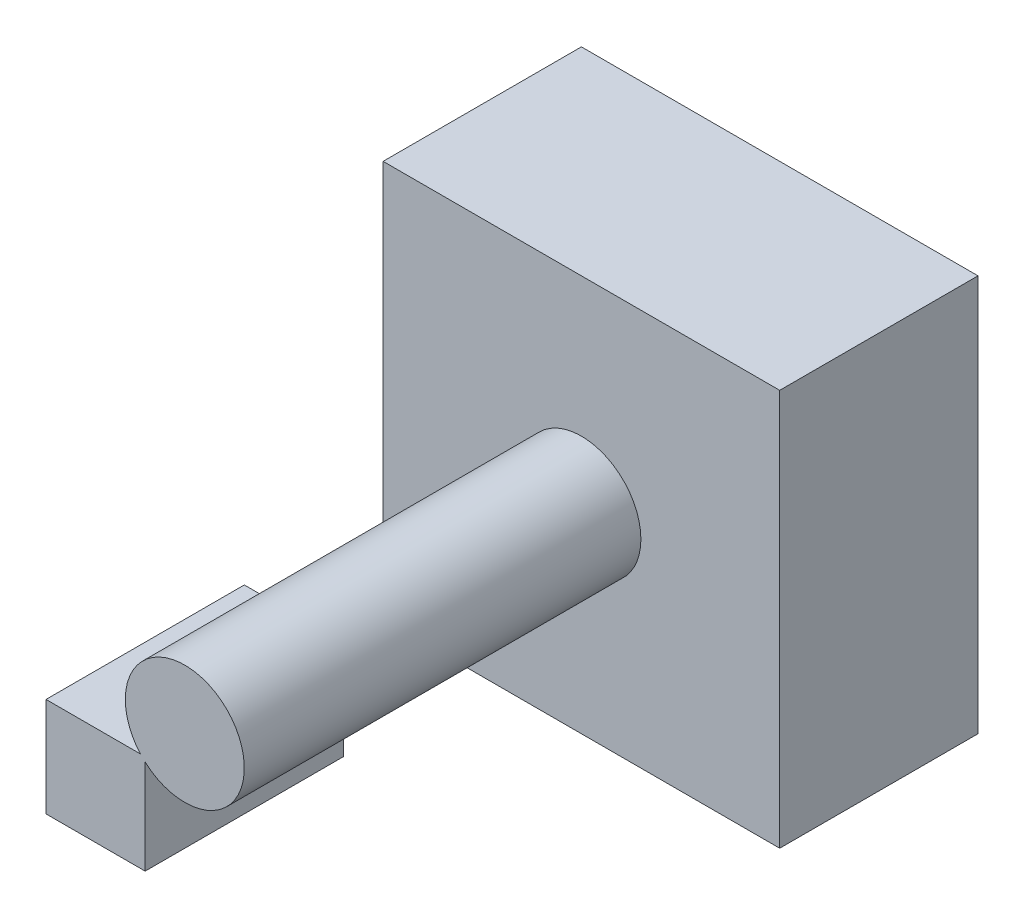
ISO-10303-21;
HEADER;
FILE_DESCRIPTION(('STEP AP214'),'2;1');
FILE_NAME('part.step','',(''),(''),'','','');
FILE_SCHEMA(('AUTOMOTIVE_DESIGN { 1 0 10303 214 1 1 1 1 }'));
ENDSEC;
DATA;
#1=APPLICATION_CONTEXT('core data for automotive mechanical design processes');
#2=APPLICATION_PROTOCOL_DEFINITION('international standard','automotive_design',2000,#1);
#3=PRODUCT_CONTEXT('',#1,'mechanical');
#4=PRODUCT('Part','Part','',(#3));
#5=PRODUCT_RELATED_PRODUCT_CATEGORY('part','',(#4));
#6=PRODUCT_DEFINITION_FORMATION('','',#4);
#7=PRODUCT_DEFINITION_CONTEXT('part definition',#1,'design');
#8=PRODUCT_DEFINITION('design','',#6,#7);
#9=PRODUCT_DEFINITION_SHAPE('','',#8);
#10=(LENGTH_UNIT() NAMED_UNIT(*) SI_UNIT(.MILLI.,.METRE.));
#11=(NAMED_UNIT(*) PLANE_ANGLE_UNIT() SI_UNIT($,.RADIAN.));
#12=(NAMED_UNIT(*) SI_UNIT($,.STERADIAN.) SOLID_ANGLE_UNIT());
#13=UNCERTAINTY_MEASURE_WITH_UNIT(LENGTH_MEASURE(1.E-05),#10,'distance_accuracy_value','');
#14=(GEOMETRIC_REPRESENTATION_CONTEXT(3) GLOBAL_UNCERTAINTY_ASSIGNED_CONTEXT((#13)) GLOBAL_UNIT_ASSIGNED_CONTEXT((#10,
#11,#12)) REPRESENTATION_CONTEXT('',''));
#15=CARTESIAN_POINT('',(0.,0.,0.));
#16=DIRECTION('',(0.,0.,1.));
#17=DIRECTION('',(1.,0.,0.));
#18=AXIS2_PLACEMENT_3D('',#15,#16,#17);
#19=CARTESIAN_POINT('',(10.,10.,30.));
#20=DIRECTION('',(0.,0.,-1.));
#21=DIRECTION('',(-1.,0.,0.));
#22=AXIS2_PLACEMENT_3D('',#19,#20,#21);
#23=CYLINDRICAL_SURFACE('',#22,3.);
#24=CARTESIAN_POINT('',(10.,10.,10.));
#25=DIRECTION('',(0.,0.,1.));
#26=DIRECTION('',(1.,0.,0.));
#27=AXIS2_PLACEMENT_3D('',#24,#25,#26);
#28=CIRCLE('',#27,3.);
#29=CARTESIAN_POINT('',(13.,10.,10.));
#30=VERTEX_POINT('',#29);
#31=EDGE_CURVE('E49',#30,#30,#28,.T.);
#32=ORIENTED_EDGE('',*,*,#31,.T.);
#33=EDGE_LOOP('',(#32));
#34=FACE_BOUND('',#33,.T.);
#35=DIRECTION('',(0.,0.,-1.));
#36=VECTOR('',#35,1.);
#37=CARTESIAN_POINT('',(8.,7.76393202250021,30.));
#38=LINE('',#37,#36);
#39=CARTESIAN_POINT('',(8.,7.76393202250021,20.));
#40=VERTEX_POINT('',#39);
#41=CARTESIAN_POINT('',(8.,7.76393202250021,30.));
#42=VERTEX_POINT('',#41);
#43=EDGE_CURVE('E149',#40,#42,#38,.F.);
#44=ORIENTED_EDGE('',*,*,#43,.F.);
#45=CARTESIAN_POINT('',(10.,10.,20.));
#46=DIRECTION('',(0.,0.,-1.));
#47=DIRECTION('',(-1.,0.,0.));
#48=AXIS2_PLACEMENT_3D('',#45,#46,#47);
#49=CIRCLE('',#48,3.);
#50=CARTESIAN_POINT('',(7.76393202250021,8.,20.));
#51=VERTEX_POINT('',#50);
#52=EDGE_CURVE('E11',#40,#51,#49,.T.);
#53=ORIENTED_EDGE('',*,*,#52,.T.);
#54=DIRECTION('',(0.,0.,-1.));
#55=VECTOR('',#54,1.);
#56=CARTESIAN_POINT('',(7.76393202250021,8.,30.));
#57=LINE('',#56,#55);
#58=CARTESIAN_POINT('',(7.76393202250021,8.,30.));
#59=VERTEX_POINT('',#58);
#60=EDGE_CURVE('E150',#59,#51,#57,.T.);
#61=ORIENTED_EDGE('',*,*,#60,.F.);
#62=CARTESIAN_POINT('',(10.,10.,30.));
#63=DIRECTION('',(0.,0.,1.));
#64=DIRECTION('',(1.,0.,0.));
#65=AXIS2_PLACEMENT_3D('',#62,#63,#64);
#66=CIRCLE('',#65,3.);
#67=EDGE_CURVE('E156',#42,#59,#66,.T.);
#68=ORIENTED_EDGE('',*,*,#67,.F.);
#69=EDGE_LOOP('',(#44,#53,#61,#68));
#70=FACE_BOUND('',#69,.T.);
#71=ADVANCED_FACE('F45',(#34,#70),#23,.T.);
#72=CARTESIAN_POINT('',(0.,0.,10.));
#73=DIRECTION('',(1.,0.,0.));
#74=DIRECTION('',(0.,0.,-1.));
#75=AXIS2_PLACEMENT_3D('',#72,#73,#74);
#76=PLANE('',#75);
#77=DIRECTION('',(0.,-1.,0.));
#78=VECTOR('',#77,1.);
#79=CARTESIAN_POINT('',(0.,0.,0.));
#80=LINE('',#79,#78);
#81=CARTESIAN_POINT('',(0.,20.,0.));
#82=VERTEX_POINT('',#81);
#83=CARTESIAN_POINT('',(0.,0.,0.));
#84=VERTEX_POINT('',#83);
#85=EDGE_CURVE('E158',#82,#84,#80,.T.);
#86=ORIENTED_EDGE('',*,*,#85,.T.);
#87=DIRECTION('',(0.,0.,-1.));
#88=VECTOR('',#87,1.);
#89=CARTESIAN_POINT('',(0.,0.,10.));
#90=LINE('',#89,#88);
#91=CARTESIAN_POINT('',(0.,0.,10.));
#92=VERTEX_POINT('',#91);
#93=EDGE_CURVE('E161',#92,#84,#90,.T.);
#94=ORIENTED_EDGE('',*,*,#93,.F.);
#95=DIRECTION('',(0.,-1.,0.));
#96=VECTOR('',#95,1.);
#97=CARTESIAN_POINT('',(0.,0.,10.));
#98=LINE('',#97,#96);
#99=CARTESIAN_POINT('',(0.,20.,10.));
#100=VERTEX_POINT('',#99);
#101=EDGE_CURVE('E165',#100,#92,#98,.T.);
#102=ORIENTED_EDGE('',*,*,#101,.F.);
#103=DIRECTION('',(0.,0.,-1.));
#104=VECTOR('',#103,1.);
#105=CARTESIAN_POINT('',(0.,20.,10.));
#106=LINE('',#105,#104);
#107=EDGE_CURVE('E169',#100,#82,#106,.T.);
#108=ORIENTED_EDGE('',*,*,#107,.T.);
#109=EDGE_LOOP('',(#86,#94,#102,#108));
#110=FACE_BOUND('',#109,.T.);
#111=ADVANCED_FACE('F42',(#110),#76,.F.);
#112=CARTESIAN_POINT('',(0.,0.,10.));
#113=DIRECTION('',(0.,1.,0.));
#114=DIRECTION('',(0.,0.,1.));
#115=AXIS2_PLACEMENT_3D('',#112,#113,#114);
#116=PLANE('',#115);
#117=DIRECTION('',(1.,0.,0.));
#118=VECTOR('',#117,1.);
#119=CARTESIAN_POINT('',(0.,0.,0.));
#120=LINE('',#119,#118);
#121=CARTESIAN_POINT('',(20.,0.,0.));
#122=VERTEX_POINT('',#121);
#123=EDGE_CURVE('E173',#84,#122,#120,.T.);
#124=ORIENTED_EDGE('',*,*,#123,.T.);
#125=DIRECTION('',(0.,0.,-1.));
#126=VECTOR('',#125,1.);
#127=CARTESIAN_POINT('',(20.,0.,10.));
#128=LINE('',#127,#126);
#129=CARTESIAN_POINT('',(20.,0.,10.));
#130=VERTEX_POINT('',#129);
#131=EDGE_CURVE('E177',#130,#122,#128,.T.);
#132=ORIENTED_EDGE('',*,*,#131,.F.);
#133=DIRECTION('',(1.,0.,0.));
#134=VECTOR('',#133,1.);
#135=CARTESIAN_POINT('',(0.,0.,10.));
#136=LINE('',#135,#134);
#137=EDGE_CURVE('E92',#92,#130,#136,.T.);
#138=ORIENTED_EDGE('',*,*,#137,.F.);
#139=ORIENTED_EDGE('',*,*,#93,.T.);
#140=EDGE_LOOP('',(#124,#132,#138,#139));
#141=FACE_BOUND('',#140,.T.);
#142=ADVANCED_FACE('F185',(#141),#116,.F.);
#143=CARTESIAN_POINT('',(20.,0.,10.));
#144=DIRECTION('',(-1.,0.,0.));
#145=DIRECTION('',(0.,0.,1.));
#146=AXIS2_PLACEMENT_3D('',#143,#144,#145);
#147=PLANE('',#146);
#148=DIRECTION('',(0.,1.,0.));
#149=VECTOR('',#148,1.);
#150=CARTESIAN_POINT('',(20.,0.,0.));
#151=LINE('',#150,#149);
#152=CARTESIAN_POINT('',(20.,20.,0.));
#153=VERTEX_POINT('',#152);
#154=EDGE_CURVE('E172',#122,#153,#151,.T.);
#155=ORIENTED_EDGE('',*,*,#154,.T.);
#156=DIRECTION('',(0.,0.,-1.));
#157=VECTOR('',#156,1.);
#158=CARTESIAN_POINT('',(20.,20.,10.));
#159=LINE('',#158,#157);
#160=CARTESIAN_POINT('',(20.,20.,10.));
#161=VERTEX_POINT('',#160);
#162=EDGE_CURVE('E180',#161,#153,#159,.T.);
#163=ORIENTED_EDGE('',*,*,#162,.F.);
#164=DIRECTION('',(0.,1.,0.));
#165=VECTOR('',#164,1.);
#166=CARTESIAN_POINT('',(20.,0.,10.));
#167=LINE('',#166,#165);
#168=EDGE_CURVE('E164',#130,#161,#167,.T.);
#169=ORIENTED_EDGE('',*,*,#168,.F.);
#170=ORIENTED_EDGE('',*,*,#131,.T.);
#171=EDGE_LOOP('',(#155,#163,#169,#170));
#172=FACE_BOUND('',#171,.T.);
#173=ADVANCED_FACE('F192',(#172),#147,.F.);
#174=CARTESIAN_POINT('',(0.,20.,10.));
#175=DIRECTION('',(0.,-1.,0.));
#176=DIRECTION('',(0.,0.,-1.));
#177=AXIS2_PLACEMENT_3D('',#174,#175,#176);
#178=PLANE('',#177);
#179=DIRECTION('',(-1.,0.,0.));
#180=VECTOR('',#179,1.);
#181=CARTESIAN_POINT('',(0.,20.,0.));
#182=LINE('',#181,#180);
#183=EDGE_CURVE('E87',#153,#82,#182,.T.);
#184=ORIENTED_EDGE('',*,*,#183,.T.);
#185=ORIENTED_EDGE('',*,*,#107,.F.);
#186=DIRECTION('',(-1.,0.,0.));
#187=VECTOR('',#186,1.);
#188=CARTESIAN_POINT('',(0.,20.,10.));
#189=LINE('',#188,#187);
#190=EDGE_CURVE('E68',#161,#100,#189,.T.);
#191=ORIENTED_EDGE('',*,*,#190,.F.);
#192=ORIENTED_EDGE('',*,*,#162,.T.);
#193=EDGE_LOOP('',(#184,#185,#191,#192));
#194=FACE_BOUND('',#193,.T.);
#195=ADVANCED_FACE('F195',(#194),#178,.F.);
#196=CARTESIAN_POINT('',(0.,0.,10.));
#197=DIRECTION('',(0.,0.,-1.));
#198=DIRECTION('',(-1.,0.,0.));
#199=AXIS2_PLACEMENT_3D('',#196,#197,#198);
#200=PLANE('',#199);
#201=ORIENTED_EDGE('',*,*,#31,.F.);
#202=EDGE_LOOP('',(#201));
#203=FACE_BOUND('',#202,.T.);
#204=ORIENTED_EDGE('',*,*,#101,.T.);
#205=ORIENTED_EDGE('',*,*,#137,.T.);
#206=ORIENTED_EDGE('',*,*,#168,.T.);
#207=ORIENTED_EDGE('',*,*,#190,.T.);
#208=EDGE_LOOP('',(#204,#205,#206,#207));
#209=FACE_BOUND('',#208,.T.);
#210=ADVANCED_FACE('F191',(#203,#209),#200,.F.);
#211=CARTESIAN_POINT('',(0.,0.,0.));
#212=DIRECTION('',(0.,0.,-1.));
#213=DIRECTION('',(-1.,0.,0.));
#214=AXIS2_PLACEMENT_3D('',#211,#212,#213);
#215=PLANE('',#214);
#216=ORIENTED_EDGE('',*,*,#85,.F.);
#217=ORIENTED_EDGE('',*,*,#183,.F.);
#218=ORIENTED_EDGE('',*,*,#154,.F.);
#219=ORIENTED_EDGE('',*,*,#123,.F.);
#220=EDGE_LOOP('',(#216,#217,#218,#219));
#221=FACE_BOUND('',#220,.T.);
#222=ADVANCED_FACE('F189',(#221),#215,.T.);
#223=CARTESIAN_POINT('',(10.,10.,30.));
#224=DIRECTION('',(0.,0.,1.));
#225=DIRECTION('',(1.,0.,0.));
#226=AXIS2_PLACEMENT_3D('',#223,#224,#225);
#227=PLANE('',#226);
#228=ORIENTED_EDGE('',*,*,#67,.T.);
#229=DIRECTION('',(-1.,0.,0.));
#230=VECTOR('',#229,1.);
#231=CARTESIAN_POINT('',(3.,8.,30.));
#232=LINE('',#231,#230);
#233=CARTESIAN_POINT('',(3.,8.,30.));
#234=VERTEX_POINT('',#233);
#235=EDGE_CURVE('E138',#59,#234,#232,.T.);
#236=ORIENTED_EDGE('',*,*,#235,.T.);
#237=DIRECTION('',(0.,-1.,0.));
#238=VECTOR('',#237,1.);
#239=CARTESIAN_POINT('',(3.,3.,30.));
#240=LINE('',#239,#238);
#241=CARTESIAN_POINT('',(3.,3.,30.));
#242=VERTEX_POINT('',#241);
#243=EDGE_CURVE('E131',#234,#242,#240,.T.);
#244=ORIENTED_EDGE('',*,*,#243,.T.);
#245=DIRECTION('',(1.,0.,0.));
#246=VECTOR('',#245,1.);
#247=CARTESIAN_POINT('',(3.,3.,30.));
#248=LINE('',#247,#246);
#249=CARTESIAN_POINT('',(8.,3.,30.));
#250=VERTEX_POINT('',#249);
#251=EDGE_CURVE('E121',#242,#250,#248,.T.);
#252=ORIENTED_EDGE('',*,*,#251,.T.);
#253=DIRECTION('',(0.,1.,0.));
#254=VECTOR('',#253,1.);
#255=CARTESIAN_POINT('',(8.,3.,30.));
#256=LINE('',#255,#254);
#257=EDGE_CURVE('E135',#250,#42,#256,.T.);
#258=ORIENTED_EDGE('',*,*,#257,.T.);
#259=EDGE_LOOP('',(#228,#236,#244,#252,#258));
#260=FACE_BOUND('',#259,.T.);
#261=ADVANCED_FACE('F136',(#260),#227,.T.);
#262=CARTESIAN_POINT('',(8.,3.,30.));
#263=DIRECTION('',(-1.,0.,0.));
#264=DIRECTION('',(0.,0.,1.));
#265=AXIS2_PLACEMENT_3D('',#262,#263,#264);
#266=PLANE('',#265);
#267=DIRECTION('',(0.,1.,0.));
#268=VECTOR('',#267,1.);
#269=CARTESIAN_POINT('',(8.,3.,20.));
#270=LINE('',#269,#268);
#271=CARTESIAN_POINT('',(8.,3.,20.));
#272=VERTEX_POINT('',#271);
#273=EDGE_CURVE('E231',#272,#40,#270,.T.);
#274=ORIENTED_EDGE('',*,*,#273,.T.);
#275=ORIENTED_EDGE('',*,*,#43,.T.);
#276=ORIENTED_EDGE('',*,*,#257,.F.);
#277=DIRECTION('',(0.,0.,-1.));
#278=VECTOR('',#277,1.);
#279=CARTESIAN_POINT('',(8.,3.,30.));
#280=LINE('',#279,#278);
#281=EDGE_CURVE('E128',#250,#272,#280,.T.);
#282=ORIENTED_EDGE('',*,*,#281,.T.);
#283=EDGE_LOOP('',(#274,#275,#276,#282));
#284=FACE_BOUND('',#283,.T.);
#285=ADVANCED_FACE('F214',(#284),#266,.F.);
#286=CARTESIAN_POINT('',(3.,8.,30.));
#287=DIRECTION('',(0.,-1.,0.));
#288=DIRECTION('',(0.,0.,-1.));
#289=AXIS2_PLACEMENT_3D('',#286,#287,#288);
#290=PLANE('',#289);
#291=ORIENTED_EDGE('',*,*,#235,.F.);
#292=ORIENTED_EDGE('',*,*,#60,.T.);
#293=DIRECTION('',(-1.,0.,0.));
#294=VECTOR('',#293,1.);
#295=CARTESIAN_POINT('',(3.,8.,20.));
#296=LINE('',#295,#294);
#297=CARTESIAN_POINT('',(3.,8.,20.));
#298=VERTEX_POINT('',#297);
#299=EDGE_CURVE('E60',#51,#298,#296,.T.);
#300=ORIENTED_EDGE('',*,*,#299,.T.);
#301=DIRECTION('',(0.,0.,-1.));
#302=VECTOR('',#301,1.);
#303=CARTESIAN_POINT('',(3.,8.,30.));
#304=LINE('',#303,#302);
#305=EDGE_CURVE('E151',#234,#298,#304,.T.);
#306=ORIENTED_EDGE('',*,*,#305,.F.);
#307=EDGE_LOOP('',(#291,#292,#300,#306));
#308=FACE_BOUND('',#307,.T.);
#309=ADVANCED_FACE('F217',(#308),#290,.F.);
#310=CARTESIAN_POINT('',(3.,3.,30.));
#311=DIRECTION('',(1.,0.,0.));
#312=DIRECTION('',(0.,0.,-1.));
#313=AXIS2_PLACEMENT_3D('',#310,#311,#312);
#314=PLANE('',#313);
#315=DIRECTION('',(0.,-1.,0.));
#316=VECTOR('',#315,1.);
#317=CARTESIAN_POINT('',(3.,3.,20.));
#318=LINE('',#317,#316);
#319=CARTESIAN_POINT('',(3.,3.,20.));
#320=VERTEX_POINT('',#319);
#321=EDGE_CURVE('E148',#298,#320,#318,.T.);
#322=ORIENTED_EDGE('',*,*,#321,.T.);
#323=DIRECTION('',(0.,0.,-1.));
#324=VECTOR('',#323,1.);
#325=CARTESIAN_POINT('',(3.,3.,30.));
#326=LINE('',#325,#324);
#327=EDGE_CURVE('E130',#242,#320,#326,.T.);
#328=ORIENTED_EDGE('',*,*,#327,.F.);
#329=ORIENTED_EDGE('',*,*,#243,.F.);
#330=ORIENTED_EDGE('',*,*,#305,.T.);
#331=EDGE_LOOP('',(#322,#328,#329,#330));
#332=FACE_BOUND('',#331,.T.);
#333=ADVANCED_FACE('F144',(#332),#314,.F.);
#334=CARTESIAN_POINT('',(3.,3.,30.));
#335=DIRECTION('',(0.,1.,0.));
#336=DIRECTION('',(0.,0.,1.));
#337=AXIS2_PLACEMENT_3D('',#334,#335,#336);
#338=PLANE('',#337);
#339=DIRECTION('',(1.,0.,0.));
#340=VECTOR('',#339,1.);
#341=CARTESIAN_POINT('',(3.,3.,20.));
#342=LINE('',#341,#340);
#343=EDGE_CURVE('E237',#320,#272,#342,.T.);
#344=ORIENTED_EDGE('',*,*,#343,.T.);
#345=ORIENTED_EDGE('',*,*,#281,.F.);
#346=ORIENTED_EDGE('',*,*,#251,.F.);
#347=ORIENTED_EDGE('',*,*,#327,.T.);
#348=EDGE_LOOP('',(#344,#345,#346,#347));
#349=FACE_BOUND('',#348,.T.);
#350=ADVANCED_FACE('F124',(#349),#338,.F.);
#351=CARTESIAN_POINT('',(0.,0.,20.));
#352=DIRECTION('',(0.,0.,-1.));
#353=DIRECTION('',(-1.,0.,0.));
#354=AXIS2_PLACEMENT_3D('',#351,#352,#353);
#355=PLANE('',#354);
#356=ORIENTED_EDGE('',*,*,#52,.F.);
#357=ORIENTED_EDGE('',*,*,#273,.F.);
#358=ORIENTED_EDGE('',*,*,#343,.F.);
#359=ORIENTED_EDGE('',*,*,#321,.F.);
#360=ORIENTED_EDGE('',*,*,#299,.F.);
#361=EDGE_LOOP('',(#356,#357,#358,#359,#360));
#362=FACE_BOUND('',#361,.T.);
#363=ADVANCED_FACE('F222',(#362),#355,.T.);
#364=CLOSED_SHELL('',(#71,#111,#142,#173,#195,#210,#222,#261,#285,#309,#333,#350,#363));
#365=MANIFOLD_SOLID_BREP('B2',#364);
#366=ADVANCED_BREP_SHAPE_REPRESENTATION('',(#18,#365),#14);
#367=SHAPE_DEFINITION_REPRESENTATION(#9,#366);
ENDSEC;
END-ISO-10303-21;
